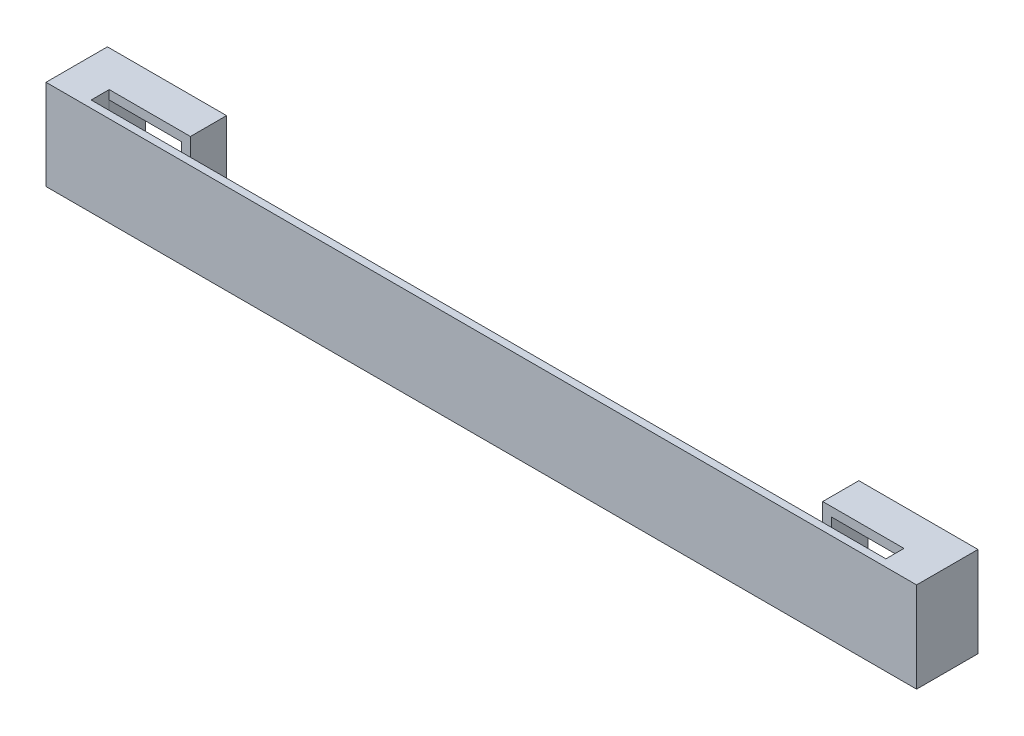
ISO-10303-21;
HEADER;
FILE_DESCRIPTION(('STEP AP214'),'2;1');
FILE_NAME('part.step','',(''),(''),'','','');
FILE_SCHEMA(('AUTOMOTIVE_DESIGN { 1 0 10303 214 1 1 1 1 }'));
ENDSEC;
DATA;
#1=APPLICATION_CONTEXT('core data for automotive mechanical design processes');
#2=APPLICATION_PROTOCOL_DEFINITION('international standard','automotive_design',2000,#1);
#3=PRODUCT_CONTEXT('',#1,'mechanical');
#4=PRODUCT('Part','Part','',(#3));
#5=PRODUCT_RELATED_PRODUCT_CATEGORY('part','',(#4));
#6=PRODUCT_DEFINITION_FORMATION('','',#4);
#7=PRODUCT_DEFINITION_CONTEXT('part definition',#1,'design');
#8=PRODUCT_DEFINITION('design','',#6,#7);
#9=PRODUCT_DEFINITION_SHAPE('','',#8);
#10=(LENGTH_UNIT() NAMED_UNIT(*) SI_UNIT(.MILLI.,.METRE.));
#11=(NAMED_UNIT(*) PLANE_ANGLE_UNIT() SI_UNIT($,.RADIAN.));
#12=(NAMED_UNIT(*) SI_UNIT($,.STERADIAN.) SOLID_ANGLE_UNIT());
#13=UNCERTAINTY_MEASURE_WITH_UNIT(LENGTH_MEASURE(1.E-05),#10,'distance_accuracy_value','');
#14=(GEOMETRIC_REPRESENTATION_CONTEXT(3) GLOBAL_UNCERTAINTY_ASSIGNED_CONTEXT((#13)) GLOBAL_UNIT_ASSIGNED_CONTEXT((#10,
#11,#12)) REPRESENTATION_CONTEXT('',''));
#15=CARTESIAN_POINT('',(0.,0.,0.));
#16=DIRECTION('',(0.,0.,1.));
#17=DIRECTION('',(1.,0.,0.));
#18=AXIS2_PLACEMENT_3D('',#15,#16,#17);
#19=CARTESIAN_POINT('',(0.,0.,10.));
#20=DIRECTION('',(0.,0.,1.));
#21=DIRECTION('',(1.,0.,0.));
#22=AXIS2_PLACEMENT_3D('',#19,#20,#21);
#23=PLANE('',#22);
#24=DIRECTION('',(1.,0.,0.));
#25=VECTOR('',#24,1.);
#26=CARTESIAN_POINT('',(0.,65.5,10.));
#27=LINE('',#26,#25);
#28=CARTESIAN_POINT('',(-113.7451797679,65.5,10.));
#29=VERTEX_POINT('',#28);
#30=CARTESIAN_POINT('',(-91.2644606962993,65.5,10.));
#31=VERTEX_POINT('',#30);
#32=EDGE_CURVE('E269',#29,#31,#27,.T.);
#33=ORIENTED_EDGE('',*,*,#32,.F.);
#34=DIRECTION('',(0.,-1.,0.));
#35=VECTOR('',#34,1.);
#36=CARTESIAN_POINT('',(-113.7451797679,298.654488395828,10.));
#37=LINE('',#36,#35);
#38=CARTESIAN_POINT('',(-113.7451797679,63.,10.));
#39=VERTEX_POINT('',#38);
#40=EDGE_CURVE('E239',#29,#39,#37,.T.);
#41=ORIENTED_EDGE('',*,*,#40,.T.);
#42=DIRECTION('',(1.,0.,0.));
#43=VECTOR('',#42,1.);
#44=CARTESIAN_POINT('',(0.,63.,10.));
#45=LINE('',#44,#43);
#46=CARTESIAN_POINT('',(-93.7548202320998,63.,10.));
#47=VERTEX_POINT('',#46);
#48=EDGE_CURVE('E266',#39,#47,#45,.T.);
#49=ORIENTED_EDGE('',*,*,#48,.T.);
#50=DIRECTION('',(0.,1.,0.));
#51=VECTOR('',#50,1.);
#52=CARTESIAN_POINT('',(-93.7548202320998,0.,10.));
#53=LINE('',#52,#51);
#54=CARTESIAN_POINT('',(-93.7548202320998,43.,10.));
#55=VERTEX_POINT('',#54);
#56=EDGE_CURVE('E259',#55,#47,#53,.T.);
#57=ORIENTED_EDGE('',*,*,#56,.F.);
#58=DIRECTION('',(1.,0.,0.));
#59=VECTOR('',#58,1.);
#60=CARTESIAN_POINT('',(0.,43.,10.));
#61=LINE('',#60,#59);
#62=CARTESIAN_POINT('',(-113.7451797679,43.,10.));
#63=VERTEX_POINT('',#62);
#64=EDGE_CURVE('E262',#63,#55,#61,.T.);
#65=ORIENTED_EDGE('',*,*,#64,.F.);
#66=CARTESIAN_POINT('',(-113.7451797679,40.5,10.));
#67=VERTEX_POINT('',#66);
#68=EDGE_CURVE('E65',#63,#67,#37,.T.);
#69=ORIENTED_EDGE('',*,*,#68,.T.);
#70=DIRECTION('',(1.,0.,0.));
#71=VECTOR('',#70,1.);
#72=CARTESIAN_POINT('',(0.,40.5,10.));
#73=LINE('',#72,#71);
#74=CARTESIAN_POINT('',(-91.2644606962993,40.5,10.));
#75=VERTEX_POINT('',#74);
#76=EDGE_CURVE('E253',#67,#75,#73,.T.);
#77=ORIENTED_EDGE('',*,*,#76,.T.);
#78=DIRECTION('',(0.,1.,0.));
#79=VECTOR('',#78,1.);
#80=CARTESIAN_POINT('',(-91.2644606962993,0.,10.));
#81=LINE('',#80,#79);
#82=EDGE_CURVE('E255',#75,#31,#81,.T.);
#83=ORIENTED_EDGE('',*,*,#82,.T.);
#84=EDGE_LOOP('',(#33,#41,#49,#57,#65,#69,#77,#83));
#85=FACE_BOUND('',#84,.T.);
#86=ADVANCED_FACE('F48',(#85),#23,.T.);
#87=CARTESIAN_POINT('',(0.,0.,10.));
#88=DIRECTION('',(0.,0.,1.));
#89=DIRECTION('',(1.,0.,0.));
#90=AXIS2_PLACEMENT_3D('',#87,#88,#89);
#91=PLANE('',#90);
#92=DIRECTION('',(0.,1.,0.));
#93=VECTOR('',#92,1.);
#94=CARTESIAN_POINT('',(106.2451797679,0.,10.));
#95=LINE('',#94,#93);
#96=CARTESIAN_POINT('',(106.2451797679,43.,10.));
#97=VERTEX_POINT('',#96);
#98=CARTESIAN_POINT('',(106.2451797679,63.,10.));
#99=VERTEX_POINT('',#98);
#100=EDGE_CURVE('E332',#97,#99,#95,.T.);
#101=ORIENTED_EDGE('',*,*,#100,.F.);
#102=DIRECTION('',(-1.,0.,0.));
#103=VECTOR('',#102,1.);
#104=CARTESIAN_POINT('',(0.,43.,10.));
#105=LINE('',#104,#103);
#106=CARTESIAN_POINT('',(86.2451797679002,43.,10.));
#107=VERTEX_POINT('',#106);
#108=EDGE_CURVE('E349',#97,#107,#105,.T.);
#109=ORIENTED_EDGE('',*,*,#108,.T.);
#110=DIRECTION('',(0.,1.,0.));
#111=VECTOR('',#110,1.);
#112=CARTESIAN_POINT('',(86.2451797679002,0.,10.));
#113=LINE('',#112,#111);
#114=CARTESIAN_POINT('',(86.2451797679002,63.,10.));
#115=VERTEX_POINT('',#114);
#116=EDGE_CURVE('E343',#107,#115,#113,.T.);
#117=ORIENTED_EDGE('',*,*,#116,.T.);
#118=DIRECTION('',(-1.,0.,0.));
#119=VECTOR('',#118,1.);
#120=CARTESIAN_POINT('',(0.,63.,10.));
#121=LINE('',#120,#119);
#122=EDGE_CURVE('E320',#99,#115,#121,.T.);
#123=ORIENTED_EDGE('',*,*,#122,.F.);
#124=EDGE_LOOP('',(#101,#109,#117,#123));
#125=FACE_BOUND('',#124,.T.);
#126=DIRECTION('',(-1.,0.,0.));
#127=VECTOR('',#126,1.);
#128=CARTESIAN_POINT('',(0.,40.5,10.));
#129=LINE('',#128,#127);
#130=CARTESIAN_POINT('',(106.245539303701,40.5,10.));
#131=VERTEX_POINT('',#130);
#132=CARTESIAN_POINT('',(83.7548202320998,40.5,10.));
#133=VERTEX_POINT('',#132);
#134=EDGE_CURVE('E321',#131,#133,#129,.T.);
#135=ORIENTED_EDGE('',*,*,#134,.F.);
#136=DIRECTION('',(0.,-1.,0.));
#137=VECTOR('',#136,1.);
#138=CARTESIAN_POINT('',(106.245539303701,79.3217256520306,10.));
#139=LINE('',#138,#137);
#140=CARTESIAN_POINT('',(106.245539303701,65.5,10.));
#141=VERTEX_POINT('',#140);
#142=EDGE_CURVE('E305',#141,#131,#139,.T.);
#143=ORIENTED_EDGE('',*,*,#142,.F.);
#144=DIRECTION('',(1.,0.,0.));
#145=VECTOR('',#144,1.);
#146=CARTESIAN_POINT('',(0.,65.5,10.));
#147=LINE('',#146,#145);
#148=CARTESIAN_POINT('',(83.7548202320998,65.5,10.));
#149=VERTEX_POINT('',#148);
#150=EDGE_CURVE('E210',#149,#141,#147,.T.);
#151=ORIENTED_EDGE('',*,*,#150,.F.);
#152=DIRECTION('',(0.,-1.,0.));
#153=VECTOR('',#152,1.);
#154=CARTESIAN_POINT('',(83.7548202320998,63.,10.));
#155=LINE('',#154,#153);
#156=EDGE_CURVE('E352',#149,#133,#155,.T.);
#157=ORIENTED_EDGE('',*,*,#156,.T.);
#158=EDGE_LOOP('',(#135,#143,#151,#157));
#159=FACE_BOUND('',#158,.T.);
#160=ADVANCED_FACE('F407',(#125,#159),#91,.T.);
#161=CARTESIAN_POINT('',(0.,65.5,10.));
#162=DIRECTION('',(0.,1.,0.));
#163=DIRECTION('',(0.,0.,1.));
#164=AXIS2_PLACEMENT_3D('',#161,#162,#163);
#165=PLANE('',#164);
#166=DIRECTION('',(0.,0.,-1.));
#167=VECTOR('',#166,1.);
#168=CARTESIAN_POINT('',(116.735539303701,65.5,17.));
#169=LINE('',#168,#167);
#170=CARTESIAN_POINT('',(116.735539303701,65.5,17.));
#171=VERTEX_POINT('',#170);
#172=CARTESIAN_POINT('',(116.735539303701,65.5,0.));
#173=VERTEX_POINT('',#172);
#174=EDGE_CURVE('E205',#171,#173,#169,.T.);
#175=ORIENTED_EDGE('',*,*,#174,.T.);
#176=DIRECTION('',(1.,0.,0.));
#177=VECTOR('',#176,1.);
#178=CARTESIAN_POINT('',(0.,65.5,0.));
#179=LINE('',#178,#177);
#180=CARTESIAN_POINT('',(83.7548202320998,65.5,0.));
#181=VERTEX_POINT('',#180);
#182=EDGE_CURVE('E52',#181,#173,#179,.T.);
#183=ORIENTED_EDGE('',*,*,#182,.F.);
#184=DIRECTION('',(0.,0.,-1.));
#185=VECTOR('',#184,1.);
#186=CARTESIAN_POINT('',(83.7548202320998,65.5,10.));
#187=LINE('',#186,#185);
#188=EDGE_CURVE('E11',#149,#181,#187,.T.);
#189=ORIENTED_EDGE('',*,*,#188,.F.);
#190=ORIENTED_EDGE('',*,*,#150,.T.);
#191=DIRECTION('',(0.,0.,1.));
#192=VECTOR('',#191,1.);
#193=CARTESIAN_POINT('',(106.245539303701,65.5,10.));
#194=LINE('',#193,#192);
#195=CARTESIAN_POINT('',(106.245539303701,65.5,15.));
#196=VERTEX_POINT('',#195);
#197=EDGE_CURVE('E309',#141,#196,#194,.T.);
#198=ORIENTED_EDGE('',*,*,#197,.T.);
#199=DIRECTION('',(-1.,0.,0.));
#200=VECTOR('',#199,1.);
#201=CARTESIAN_POINT('',(108.735539303701,65.5,15.));
#202=LINE('',#201,#200);
#203=CARTESIAN_POINT('',(-113.7451797679,65.5000000000001,15.));
#204=VERTEX_POINT('',#203);
#205=EDGE_CURVE('E234',#196,#204,#202,.T.);
#206=ORIENTED_EDGE('',*,*,#205,.T.);
#207=DIRECTION('',(0.,0.,-1.));
#208=VECTOR('',#207,1.);
#209=CARTESIAN_POINT('',(-113.7451797679,65.5,15.));
#210=LINE('',#209,#208);
#211=EDGE_CURVE('E230',#204,#29,#210,.T.);
#212=ORIENTED_EDGE('',*,*,#211,.T.);
#213=ORIENTED_EDGE('',*,*,#32,.T.);
#214=DIRECTION('',(0.,0.,-1.));
#215=VECTOR('',#214,1.);
#216=CARTESIAN_POINT('',(-91.2644606962993,65.5,10.));
#217=LINE('',#216,#215);
#218=CARTESIAN_POINT('',(-91.2644606962993,65.5,0.));
#219=VERTEX_POINT('',#218);
#220=EDGE_CURVE('E249',#31,#219,#217,.T.);
#221=ORIENTED_EDGE('',*,*,#220,.T.);
#222=DIRECTION('',(1.,0.,0.));
#223=VECTOR('',#222,1.);
#224=CARTESIAN_POINT('',(0.,65.5,0.));
#225=LINE('',#224,#223);
#226=CARTESIAN_POINT('',(-124.2451797679,65.5,0.));
#227=VERTEX_POINT('',#226);
#228=EDGE_CURVE('E256',#227,#219,#225,.T.);
#229=ORIENTED_EDGE('',*,*,#228,.F.);
#230=DIRECTION('',(0.,0.,1.));
#231=VECTOR('',#230,1.);
#232=CARTESIAN_POINT('',(-124.2451797679,65.5,8.));
#233=LINE('',#232,#231);
#234=CARTESIAN_POINT('',(-124.2451797679,65.5000000000001,17.));
#235=VERTEX_POINT('',#234);
#236=EDGE_CURVE('E237',#227,#235,#233,.T.);
#237=ORIENTED_EDGE('',*,*,#236,.T.);
#238=DIRECTION('',(1.,0.,0.));
#239=VECTOR('',#238,1.);
#240=CARTESIAN_POINT('',(108.735539303701,65.5,17.));
#241=LINE('',#240,#239);
#242=EDGE_CURVE('E207',#235,#171,#241,.T.);
#243=ORIENTED_EDGE('',*,*,#242,.T.);
#244=EDGE_LOOP('',(#175,#183,#189,#190,#198,#206,#212,#213,#221,#229,#237,#243));
#245=FACE_BOUND('',#244,.T.);
#246=ADVANCED_FACE('F50',(#245),#165,.T.);
#247=CARTESIAN_POINT('',(0.,0.,0.));
#248=DIRECTION('',(0.,0.,1.));
#249=DIRECTION('',(1.,0.,0.));
#250=AXIS2_PLACEMENT_3D('',#247,#248,#249);
#251=PLANE('',#250);
#252=DIRECTION('',(0.,1.,0.));
#253=VECTOR('',#252,1.);
#254=CARTESIAN_POINT('',(106.2451797679,0.,0.));
#255=LINE('',#254,#253);
#256=CARTESIAN_POINT('',(106.2451797679,43.,0.));
#257=VERTEX_POINT('',#256);
#258=CARTESIAN_POINT('',(106.2451797679,63.,0.));
#259=VERTEX_POINT('',#258);
#260=EDGE_CURVE('E336',#257,#259,#255,.T.);
#261=ORIENTED_EDGE('',*,*,#260,.T.);
#262=DIRECTION('',(-1.,0.,0.));
#263=VECTOR('',#262,1.);
#264=CARTESIAN_POINT('',(0.,63.,0.));
#265=LINE('',#264,#263);
#266=CARTESIAN_POINT('',(86.2451797679002,63.,0.));
#267=VERTEX_POINT('',#266);
#268=EDGE_CURVE('E333',#259,#267,#265,.T.);
#269=ORIENTED_EDGE('',*,*,#268,.T.);
#270=DIRECTION('',(0.,1.,0.));
#271=VECTOR('',#270,1.);
#272=CARTESIAN_POINT('',(86.2451797679002,0.,0.));
#273=LINE('',#272,#271);
#274=CARTESIAN_POINT('',(86.2451797679002,43.,0.));
#275=VERTEX_POINT('',#274);
#276=EDGE_CURVE('E324',#275,#267,#273,.T.);
#277=ORIENTED_EDGE('',*,*,#276,.F.);
#278=DIRECTION('',(-1.,0.,0.));
#279=VECTOR('',#278,1.);
#280=CARTESIAN_POINT('',(0.,43.,0.));
#281=LINE('',#280,#279);
#282=EDGE_CURVE('E325',#257,#275,#281,.T.);
#283=ORIENTED_EDGE('',*,*,#282,.F.);
#284=EDGE_LOOP('',(#261,#269,#277,#283));
#285=FACE_BOUND('',#284,.T.);
#286=DIRECTION('',(0.,1.,0.));
#287=VECTOR('',#286,1.);
#288=CARTESIAN_POINT('',(83.7548202320998,0.,0.));
#289=LINE('',#288,#287);
#290=CARTESIAN_POINT('',(83.7548202320998,40.5,0.));
#291=VERTEX_POINT('',#290);
#292=EDGE_CURVE('E200',#291,#181,#289,.T.);
#293=ORIENTED_EDGE('',*,*,#292,.T.);
#294=ORIENTED_EDGE('',*,*,#182,.T.);
#295=DIRECTION('',(0.,1.,0.));
#296=VECTOR('',#295,1.);
#297=CARTESIAN_POINT('',(116.735539303701,29.1862915010152,0.));
#298=LINE('',#297,#296);
#299=CARTESIAN_POINT('',(116.735539303701,40.5,0.));
#300=VERTEX_POINT('',#299);
#301=EDGE_CURVE('E198',#300,#173,#298,.T.);
#302=ORIENTED_EDGE('',*,*,#301,.F.);
#303=DIRECTION('',(-1.,0.,0.));
#304=VECTOR('',#303,1.);
#305=CARTESIAN_POINT('',(0.,40.5,0.));
#306=LINE('',#305,#304);
#307=EDGE_CURVE('E203',#300,#291,#306,.T.);
#308=ORIENTED_EDGE('',*,*,#307,.T.);
#309=EDGE_LOOP('',(#293,#294,#302,#308));
#310=FACE_BOUND('',#309,.T.);
#311=ADVANCED_FACE('F195',(#285,#310),#251,.F.);
#312=CARTESIAN_POINT('',(106.2451797679,0.,10.));
#313=DIRECTION('',(-1.,0.,0.));
#314=DIRECTION('',(0.,0.,1.));
#315=AXIS2_PLACEMENT_3D('',#312,#313,#314);
#316=PLANE('',#315);
#317=ORIENTED_EDGE('',*,*,#260,.F.);
#318=DIRECTION('',(0.,0.,-1.));
#319=VECTOR('',#318,1.);
#320=CARTESIAN_POINT('',(106.2451797679,43.,10.));
#321=LINE('',#320,#319);
#322=EDGE_CURVE('E322',#97,#257,#321,.T.);
#323=ORIENTED_EDGE('',*,*,#322,.F.);
#324=ORIENTED_EDGE('',*,*,#100,.T.);
#325=DIRECTION('',(0.,0.,-1.));
#326=VECTOR('',#325,1.);
#327=CARTESIAN_POINT('',(106.2451797679,63.,10.));
#328=LINE('',#327,#326);
#329=EDGE_CURVE('E330',#99,#259,#328,.T.);
#330=ORIENTED_EDGE('',*,*,#329,.T.);
#331=EDGE_LOOP('',(#317,#323,#324,#330));
#332=FACE_BOUND('',#331,.T.);
#333=ADVANCED_FACE('F449',(#332),#316,.T.);
#334=CARTESIAN_POINT('',(0.,43.,10.));
#335=DIRECTION('',(0.,-1.,0.));
#336=DIRECTION('',(0.,0.,-1.));
#337=AXIS2_PLACEMENT_3D('',#334,#335,#336);
#338=PLANE('',#337);
#339=ORIENTED_EDGE('',*,*,#282,.T.);
#340=DIRECTION('',(0.,0.,-1.));
#341=VECTOR('',#340,1.);
#342=CARTESIAN_POINT('',(86.2451797679002,43.,10.));
#343=LINE('',#342,#341);
#344=EDGE_CURVE('E326',#107,#275,#343,.T.);
#345=ORIENTED_EDGE('',*,*,#344,.F.);
#346=ORIENTED_EDGE('',*,*,#108,.F.);
#347=ORIENTED_EDGE('',*,*,#322,.T.);
#348=EDGE_LOOP('',(#339,#345,#346,#347));
#349=FACE_BOUND('',#348,.T.);
#350=ADVANCED_FACE('F452',(#349),#338,.F.);
#351=CARTESIAN_POINT('',(86.2451797679002,0.,10.));
#352=DIRECTION('',(-1.,0.,0.));
#353=DIRECTION('',(0.,0.,1.));
#354=AXIS2_PLACEMENT_3D('',#351,#352,#353);
#355=PLANE('',#354);
#356=ORIENTED_EDGE('',*,*,#276,.T.);
#357=DIRECTION('',(0.,0.,-1.));
#358=VECTOR('',#357,1.);
#359=CARTESIAN_POINT('',(86.2451797679002,63.,10.));
#360=LINE('',#359,#358);
#361=EDGE_CURVE('E57',#115,#267,#360,.T.);
#362=ORIENTED_EDGE('',*,*,#361,.F.);
#363=ORIENTED_EDGE('',*,*,#116,.F.);
#364=ORIENTED_EDGE('',*,*,#344,.T.);
#365=EDGE_LOOP('',(#356,#362,#363,#364));
#366=FACE_BOUND('',#365,.T.);
#367=ADVANCED_FACE('F444',(#366),#355,.F.);
#368=CARTESIAN_POINT('',(83.7548202320998,0.,10.));
#369=DIRECTION('',(-1.,0.,0.));
#370=DIRECTION('',(0.,0.,1.));
#371=AXIS2_PLACEMENT_3D('',#368,#369,#370);
#372=PLANE('',#371);
#373=ORIENTED_EDGE('',*,*,#292,.F.);
#374=DIRECTION('',(0.,0.,-1.));
#375=VECTOR('',#374,1.);
#376=CARTESIAN_POINT('',(83.7548202320998,40.5,10.));
#377=LINE('',#376,#375);
#378=EDGE_CURVE('E318',#133,#291,#377,.T.);
#379=ORIENTED_EDGE('',*,*,#378,.F.);
#380=ORIENTED_EDGE('',*,*,#156,.F.);
#381=ORIENTED_EDGE('',*,*,#188,.T.);
#382=EDGE_LOOP('',(#373,#379,#380,#381));
#383=FACE_BOUND('',#382,.T.);
#384=ADVANCED_FACE('F440',(#383),#372,.T.);
#385=CARTESIAN_POINT('',(0.,40.5,10.));
#386=DIRECTION('',(0.,-1.,0.));
#387=DIRECTION('',(0.,0.,-1.));
#388=AXIS2_PLACEMENT_3D('',#385,#386,#387);
#389=PLANE('',#388);
#390=ORIENTED_EDGE('',*,*,#307,.F.);
#391=DIRECTION('',(0.,0.,-1.));
#392=VECTOR('',#391,1.);
#393=CARTESIAN_POINT('',(116.735539303701,40.5,17.));
#394=LINE('',#393,#392);
#395=CARTESIAN_POINT('',(116.735539303701,40.5,17.));
#396=VERTEX_POINT('',#395);
#397=EDGE_CURVE('E215',#396,#300,#394,.T.);
#398=ORIENTED_EDGE('',*,*,#397,.F.);
#399=DIRECTION('',(1.,0.,0.));
#400=VECTOR('',#399,1.);
#401=CARTESIAN_POINT('',(108.735539303701,40.5,17.));
#402=LINE('',#401,#400);
#403=CARTESIAN_POINT('',(-124.2451797679,40.5,17.));
#404=VERTEX_POINT('',#403);
#405=EDGE_CURVE('E303',#404,#396,#402,.T.);
#406=ORIENTED_EDGE('',*,*,#405,.F.);
#407=DIRECTION('',(0.,0.,-1.));
#408=VECTOR('',#407,1.);
#409=CARTESIAN_POINT('',(-124.2451797679,40.5,8.));
#410=LINE('',#409,#408);
#411=CARTESIAN_POINT('',(-124.2451797679,40.5,0.));
#412=VERTEX_POINT('',#411);
#413=EDGE_CURVE('E227',#404,#412,#410,.T.);
#414=ORIENTED_EDGE('',*,*,#413,.T.);
#415=DIRECTION('',(1.,0.,0.));
#416=VECTOR('',#415,1.);
#417=CARTESIAN_POINT('',(0.,40.5,0.));
#418=LINE('',#417,#416);
#419=CARTESIAN_POINT('',(-91.2644606962993,40.5,0.));
#420=VERTEX_POINT('',#419);
#421=EDGE_CURVE('E252',#412,#420,#418,.T.);
#422=ORIENTED_EDGE('',*,*,#421,.T.);
#423=DIRECTION('',(0.,0.,-1.));
#424=VECTOR('',#423,1.);
#425=CARTESIAN_POINT('',(-91.2644606962993,40.5,10.));
#426=LINE('',#425,#424);
#427=EDGE_CURVE('E271',#75,#420,#426,.T.);
#428=ORIENTED_EDGE('',*,*,#427,.F.);
#429=ORIENTED_EDGE('',*,*,#76,.F.);
#430=DIRECTION('',(0.,0.,1.));
#431=VECTOR('',#430,1.);
#432=CARTESIAN_POINT('',(-113.7451797679,40.5,15.));
#433=LINE('',#432,#431);
#434=CARTESIAN_POINT('',(-113.7451797679,40.5,15.));
#435=VERTEX_POINT('',#434);
#436=EDGE_CURVE('E220',#67,#435,#433,.T.);
#437=ORIENTED_EDGE('',*,*,#436,.T.);
#438=DIRECTION('',(1.,0.,0.));
#439=VECTOR('',#438,1.);
#440=CARTESIAN_POINT('',(108.735539303701,40.5,15.));
#441=LINE('',#440,#439);
#442=CARTESIAN_POINT('',(106.245539303701,40.5,15.));
#443=VERTEX_POINT('',#442);
#444=EDGE_CURVE('E216',#435,#443,#441,.T.);
#445=ORIENTED_EDGE('',*,*,#444,.T.);
#446=DIRECTION('',(0.,0.,1.));
#447=VECTOR('',#446,1.);
#448=CARTESIAN_POINT('',(106.245539303701,40.5,10.));
#449=LINE('',#448,#447);
#450=EDGE_CURVE('E298',#131,#443,#449,.T.);
#451=ORIENTED_EDGE('',*,*,#450,.F.);
#452=ORIENTED_EDGE('',*,*,#134,.T.);
#453=ORIENTED_EDGE('',*,*,#378,.T.);
#454=EDGE_LOOP('',(#390,#398,#406,#414,#422,#428,#429,#437,#445,#451,#452,#453));
#455=FACE_BOUND('',#454,.T.);
#456=ADVANCED_FACE('F443',(#455),#389,.T.);
#457=CARTESIAN_POINT('',(0.,63.,10.));
#458=DIRECTION('',(0.,-1.,0.));
#459=DIRECTION('',(0.,0.,-1.));
#460=AXIS2_PLACEMENT_3D('',#457,#458,#459);
#461=PLANE('',#460);
#462=ORIENTED_EDGE('',*,*,#268,.F.);
#463=ORIENTED_EDGE('',*,*,#329,.F.);
#464=ORIENTED_EDGE('',*,*,#122,.T.);
#465=ORIENTED_EDGE('',*,*,#361,.T.);
#466=EDGE_LOOP('',(#462,#463,#464,#465));
#467=FACE_BOUND('',#466,.T.);
#468=ADVANCED_FACE('F439',(#467),#461,.T.);
#469=CARTESIAN_POINT('',(106.245539303701,79.3217256520306,10.));
#470=DIRECTION('',(1.,0.,0.));
#471=DIRECTION('',(0.,0.,-1.));
#472=AXIS2_PLACEMENT_3D('',#469,#470,#471);
#473=PLANE('',#472);
#474=ORIENTED_EDGE('',*,*,#197,.F.);
#475=ORIENTED_EDGE('',*,*,#142,.T.);
#476=ORIENTED_EDGE('',*,*,#450,.T.);
#477=DIRECTION('',(0.,-1.,0.));
#478=VECTOR('',#477,1.);
#479=CARTESIAN_POINT('',(106.245539303701,79.3217256520306,15.));
#480=LINE('',#479,#478);
#481=EDGE_CURVE('E315',#196,#443,#480,.T.);
#482=ORIENTED_EDGE('',*,*,#481,.F.);
#483=EDGE_LOOP('',(#474,#475,#476,#482));
#484=FACE_BOUND('',#483,.T.);
#485=ADVANCED_FACE('F363',(#484),#473,.F.);
#486=CARTESIAN_POINT('',(108.735539303701,79.3217256520306,17.));
#487=DIRECTION('',(0.,0.,-1.));
#488=DIRECTION('',(-1.,0.,0.));
#489=AXIS2_PLACEMENT_3D('',#486,#487,#488);
#490=PLANE('',#489);
#491=DIRECTION('',(0.,1.,0.));
#492=VECTOR('',#491,1.);
#493=CARTESIAN_POINT('',(-124.2451797679,51.,17.));
#494=LINE('',#493,#492);
#495=EDGE_CURVE('E233',#404,#235,#494,.T.);
#496=ORIENTED_EDGE('',*,*,#495,.F.);
#497=ORIENTED_EDGE('',*,*,#405,.T.);
#498=DIRECTION('',(0.,-1.,0.));
#499=VECTOR('',#498,1.);
#500=CARTESIAN_POINT('',(116.735539303701,79.3217256520306,17.));
#501=LINE('',#500,#499);
#502=EDGE_CURVE('E312',#171,#396,#501,.T.);
#503=ORIENTED_EDGE('',*,*,#502,.F.);
#504=ORIENTED_EDGE('',*,*,#242,.F.);
#505=EDGE_LOOP('',(#496,#497,#503,#504));
#506=FACE_BOUND('',#505,.T.);
#507=ADVANCED_FACE('F428',(#506),#490,.F.);
#508=CARTESIAN_POINT('',(116.735539303701,79.3217256520306,17.));
#509=DIRECTION('',(-1.,0.,0.));
#510=DIRECTION('',(0.,0.,1.));
#511=AXIS2_PLACEMENT_3D('',#508,#509,#510);
#512=PLANE('',#511);
#513=ORIENTED_EDGE('',*,*,#174,.F.);
#514=ORIENTED_EDGE('',*,*,#502,.T.);
#515=ORIENTED_EDGE('',*,*,#397,.T.);
#516=ORIENTED_EDGE('',*,*,#301,.T.);
#517=EDGE_LOOP('',(#513,#514,#515,#516));
#518=FACE_BOUND('',#517,.T.);
#519=ADVANCED_FACE('F213',(#518),#512,.F.);
#520=CARTESIAN_POINT('',(113.2076752587,55.,15.));
#521=DIRECTION('',(0.,0.,1.));
#522=DIRECTION('',(1.,0.,0.));
#523=AXIS2_PLACEMENT_3D('',#520,#521,#522);
#524=PLANE('',#523);
#525=DIRECTION('',(0.,-1.,0.));
#526=VECTOR('',#525,1.);
#527=CARTESIAN_POINT('',(-113.7451797679,60.5901699437495,15.));
#528=LINE('',#527,#526);
#529=EDGE_CURVE('E244',#204,#435,#528,.T.);
#530=ORIENTED_EDGE('',*,*,#529,.F.);
#531=ORIENTED_EDGE('',*,*,#205,.F.);
#532=ORIENTED_EDGE('',*,*,#481,.T.);
#533=ORIENTED_EDGE('',*,*,#444,.F.);
#534=EDGE_LOOP('',(#530,#531,#532,#533));
#535=FACE_BOUND('',#534,.T.);
#536=ADVANCED_FACE('F367',(#535),#524,.F.);
#537=CARTESIAN_POINT('',(0.,43.,10.));
#538=DIRECTION('',(0.,1.,0.));
#539=DIRECTION('',(0.,0.,1.));
#540=AXIS2_PLACEMENT_3D('',#537,#538,#539);
#541=PLANE('',#540);
#542=DIRECTION('',(1.,0.,0.));
#543=VECTOR('',#542,1.);
#544=CARTESIAN_POINT('',(0.,43.,0.));
#545=LINE('',#544,#543);
#546=CARTESIAN_POINT('',(-113.7548202321,43.,0.));
#547=VERTEX_POINT('',#546);
#548=CARTESIAN_POINT('',(-93.7548202320998,43.,0.));
#549=VERTEX_POINT('',#548);
#550=EDGE_CURVE('E278',#547,#549,#545,.T.);
#551=ORIENTED_EDGE('',*,*,#550,.F.);
#552=DIRECTION('',(0.,0.,-1.));
#553=VECTOR('',#552,1.);
#554=CARTESIAN_POINT('',(-113.7548202321,43.,10.));
#555=LINE('',#554,#553);
#556=CARTESIAN_POINT('',(-113.7548202321,43.,10.));
#557=VERTEX_POINT('',#556);
#558=EDGE_CURVE('E294',#557,#547,#555,.T.);
#559=ORIENTED_EDGE('',*,*,#558,.F.);
#560=EDGE_CURVE('E263',#557,#63,#61,.T.);
#561=ORIENTED_EDGE('',*,*,#560,.T.);
#562=ORIENTED_EDGE('',*,*,#64,.T.);
#563=DIRECTION('',(0.,0.,-1.));
#564=VECTOR('',#563,1.);
#565=CARTESIAN_POINT('',(-93.7548202320998,43.,10.));
#566=LINE('',#565,#564);
#567=EDGE_CURVE('E296',#55,#549,#566,.T.);
#568=ORIENTED_EDGE('',*,*,#567,.T.);
#569=EDGE_LOOP('',(#551,#559,#561,#562,#568));
#570=FACE_BOUND('',#569,.T.);
#571=ADVANCED_FACE('F387',(#570),#541,.T.);
#572=CARTESIAN_POINT('',(-113.7548202321,0.,10.));
#573=DIRECTION('',(-1.,0.,0.));
#574=DIRECTION('',(0.,0.,1.));
#575=AXIS2_PLACEMENT_3D('',#572,#573,#574);
#576=PLANE('',#575);
#577=DIRECTION('',(0.,1.,0.));
#578=VECTOR('',#577,1.);
#579=CARTESIAN_POINT('',(-113.7548202321,0.,0.));
#580=LINE('',#579,#578);
#581=CARTESIAN_POINT('',(-113.7548202321,63.,0.));
#582=VERTEX_POINT('',#581);
#583=EDGE_CURVE('E281',#547,#582,#580,.T.);
#584=ORIENTED_EDGE('',*,*,#583,.T.);
#585=DIRECTION('',(0.,0.,-1.));
#586=VECTOR('',#585,1.);
#587=CARTESIAN_POINT('',(-113.7548202321,63.,10.));
#588=LINE('',#587,#586);
#589=CARTESIAN_POINT('',(-113.7548202321,63.,10.));
#590=VERTEX_POINT('',#589);
#591=EDGE_CURVE('E291',#590,#582,#588,.T.);
#592=ORIENTED_EDGE('',*,*,#591,.F.);
#593=DIRECTION('',(0.,-1.,0.));
#594=VECTOR('',#593,1.);
#595=CARTESIAN_POINT('',(-113.7548202321,0.,10.));
#596=LINE('',#595,#594);
#597=EDGE_CURVE('E246',#590,#557,#596,.T.);
#598=ORIENTED_EDGE('',*,*,#597,.T.);
#599=ORIENTED_EDGE('',*,*,#558,.T.);
#600=EDGE_LOOP('',(#584,#592,#598,#599));
#601=FACE_BOUND('',#600,.T.);
#602=ADVANCED_FACE('F383',(#601),#576,.F.);
#603=CARTESIAN_POINT('',(0.,63.,10.));
#604=DIRECTION('',(0.,1.,0.));
#605=DIRECTION('',(0.,0.,1.));
#606=AXIS2_PLACEMENT_3D('',#603,#604,#605);
#607=PLANE('',#606);
#608=DIRECTION('',(1.,0.,0.));
#609=VECTOR('',#608,1.);
#610=CARTESIAN_POINT('',(0.,63.,0.));
#611=LINE('',#610,#609);
#612=CARTESIAN_POINT('',(-93.7548202320998,63.,0.));
#613=VERTEX_POINT('',#612);
#614=EDGE_CURVE('E284',#582,#613,#611,.T.);
#615=ORIENTED_EDGE('',*,*,#614,.T.);
#616=DIRECTION('',(0.,0.,-1.));
#617=VECTOR('',#616,1.);
#618=CARTESIAN_POINT('',(-93.7548202320998,63.,10.));
#619=LINE('',#618,#617);
#620=EDGE_CURVE('E289',#47,#613,#619,.T.);
#621=ORIENTED_EDGE('',*,*,#620,.F.);
#622=ORIENTED_EDGE('',*,*,#48,.F.);
#623=EDGE_CURVE('E267',#590,#39,#45,.T.);
#624=ORIENTED_EDGE('',*,*,#623,.F.);
#625=ORIENTED_EDGE('',*,*,#591,.T.);
#626=EDGE_LOOP('',(#615,#621,#622,#624,#625));
#627=FACE_BOUND('',#626,.T.);
#628=ADVANCED_FACE('F378',(#627),#607,.F.);
#629=CARTESIAN_POINT('',(-93.7548202320998,0.,10.));
#630=DIRECTION('',(-1.,0.,0.));
#631=DIRECTION('',(0.,0.,1.));
#632=AXIS2_PLACEMENT_3D('',#629,#630,#631);
#633=PLANE('',#632);
#634=DIRECTION('',(0.,1.,0.));
#635=VECTOR('',#634,1.);
#636=CARTESIAN_POINT('',(-93.7548202320998,0.,0.));
#637=LINE('',#636,#635);
#638=EDGE_CURVE('E275',#549,#613,#637,.T.);
#639=ORIENTED_EDGE('',*,*,#638,.F.);
#640=ORIENTED_EDGE('',*,*,#567,.F.);
#641=ORIENTED_EDGE('',*,*,#56,.T.);
#642=ORIENTED_EDGE('',*,*,#620,.T.);
#643=EDGE_LOOP('',(#639,#640,#641,#642));
#644=FACE_BOUND('',#643,.T.);
#645=ADVANCED_FACE('F393',(#644),#633,.T.);
#646=CARTESIAN_POINT('',(0.,0.,0.));
#647=DIRECTION('',(0.,0.,1.));
#648=DIRECTION('',(1.,0.,0.));
#649=AXIS2_PLACEMENT_3D('',#646,#647,#648);
#650=PLANE('',#649);
#651=ORIENTED_EDGE('',*,*,#228,.T.);
#652=DIRECTION('',(0.,1.,0.));
#653=VECTOR('',#652,1.);
#654=CARTESIAN_POINT('',(-91.2644606962993,0.,0.));
#655=LINE('',#654,#653);
#656=EDGE_CURVE('E273',#420,#219,#655,.T.);
#657=ORIENTED_EDGE('',*,*,#656,.F.);
#658=ORIENTED_EDGE('',*,*,#421,.F.);
#659=DIRECTION('',(0.,1.,0.));
#660=VECTOR('',#659,1.);
#661=CARTESIAN_POINT('',(-124.2451797679,29.1862915010152,0.));
#662=LINE('',#661,#660);
#663=EDGE_CURVE('E217',#412,#227,#662,.T.);
#664=ORIENTED_EDGE('',*,*,#663,.T.);
#665=EDGE_LOOP('',(#651,#657,#658,#664));
#666=FACE_BOUND('',#665,.T.);
#667=ORIENTED_EDGE('',*,*,#638,.T.);
#668=ORIENTED_EDGE('',*,*,#614,.F.);
#669=ORIENTED_EDGE('',*,*,#583,.F.);
#670=ORIENTED_EDGE('',*,*,#550,.T.);
#671=EDGE_LOOP('',(#667,#668,#669,#670));
#672=FACE_BOUND('',#671,.T.);
#673=ADVANCED_FACE('F391',(#666,#672),#650,.F.);
#674=CARTESIAN_POINT('',(-91.2644606962993,0.,10.));
#675=DIRECTION('',(-1.,0.,0.));
#676=DIRECTION('',(0.,0.,1.));
#677=AXIS2_PLACEMENT_3D('',#674,#675,#676);
#678=PLANE('',#677);
#679=ORIENTED_EDGE('',*,*,#656,.T.);
#680=ORIENTED_EDGE('',*,*,#220,.F.);
#681=ORIENTED_EDGE('',*,*,#82,.F.);
#682=ORIENTED_EDGE('',*,*,#427,.T.);
#683=EDGE_LOOP('',(#679,#680,#681,#682));
#684=FACE_BOUND('',#683,.T.);
#685=ADVANCED_FACE('F401',(#684),#678,.F.);
#686=CARTESIAN_POINT('',(-113.7451797679,60.5901699437495,10.));
#687=DIRECTION('',(0.,0.,-1.));
#688=DIRECTION('',(-1.,0.,0.));
#689=AXIS2_PLACEMENT_3D('',#686,#687,#688);
#690=PLANE('',#689);
#691=ORIENTED_EDGE('',*,*,#597,.F.);
#692=ORIENTED_EDGE('',*,*,#623,.T.);
#693=DIRECTION('',(0.,-1.,0.));
#694=VECTOR('',#693,1.);
#695=CARTESIAN_POINT('',(-113.7451797679,60.5901699437495,10.));
#696=LINE('',#695,#694);
#697=EDGE_CURVE('E73',#39,#63,#696,.T.);
#698=ORIENTED_EDGE('',*,*,#697,.T.);
#699=ORIENTED_EDGE('',*,*,#560,.F.);
#700=EDGE_LOOP('',(#691,#692,#698,#699));
#701=FACE_BOUND('',#700,.T.);
#702=ADVANCED_FACE('F380',(#701),#690,.T.);
#703=CARTESIAN_POINT('',(-113.7451797679,60.5901699437495,15.));
#704=DIRECTION('',(1.,0.,0.));
#705=DIRECTION('',(0.,0.,-1.));
#706=AXIS2_PLACEMENT_3D('',#703,#704,#705);
#707=PLANE('',#706);
#708=ORIENTED_EDGE('',*,*,#697,.F.);
#709=ORIENTED_EDGE('',*,*,#40,.F.);
#710=ORIENTED_EDGE('',*,*,#211,.F.);
#711=ORIENTED_EDGE('',*,*,#529,.T.);
#712=ORIENTED_EDGE('',*,*,#436,.F.);
#713=ORIENTED_EDGE('',*,*,#68,.F.);
#714=EDGE_LOOP('',(#708,#709,#710,#711,#712,#713));
#715=FACE_BOUND('',#714,.T.);
#716=ADVANCED_FACE('F371',(#715),#707,.T.);
#717=CARTESIAN_POINT('',(-124.2451797679,53.,8.));
#718=DIRECTION('',(1.,0.,0.));
#719=DIRECTION('',(0.,0.,-1.));
#720=AXIS2_PLACEMENT_3D('',#717,#718,#719);
#721=PLANE('',#720);
#722=ORIENTED_EDGE('',*,*,#236,.F.);
#723=ORIENTED_EDGE('',*,*,#663,.F.);
#724=ORIENTED_EDGE('',*,*,#413,.F.);
#725=ORIENTED_EDGE('',*,*,#495,.T.);
#726=EDGE_LOOP('',(#722,#723,#724,#725));
#727=FACE_BOUND('',#726,.T.);
#728=ADVANCED_FACE('F485',(#727),#721,.F.);
#729=CLOSED_SHELL('',(#86,#160,#246,#311,#333,#350,#367,#384,#456,#468,#485,#507,#519,#536,#571,
#602,#628,#645,#673,#685,#702,#716,#728));
#730=MANIFOLD_SOLID_BREP('B2',#729);
#731=ADVANCED_BREP_SHAPE_REPRESENTATION('',(#18,#730),#14);
#732=SHAPE_DEFINITION_REPRESENTATION(#9,#731);
ENDSEC;
END-ISO-10303-21;
